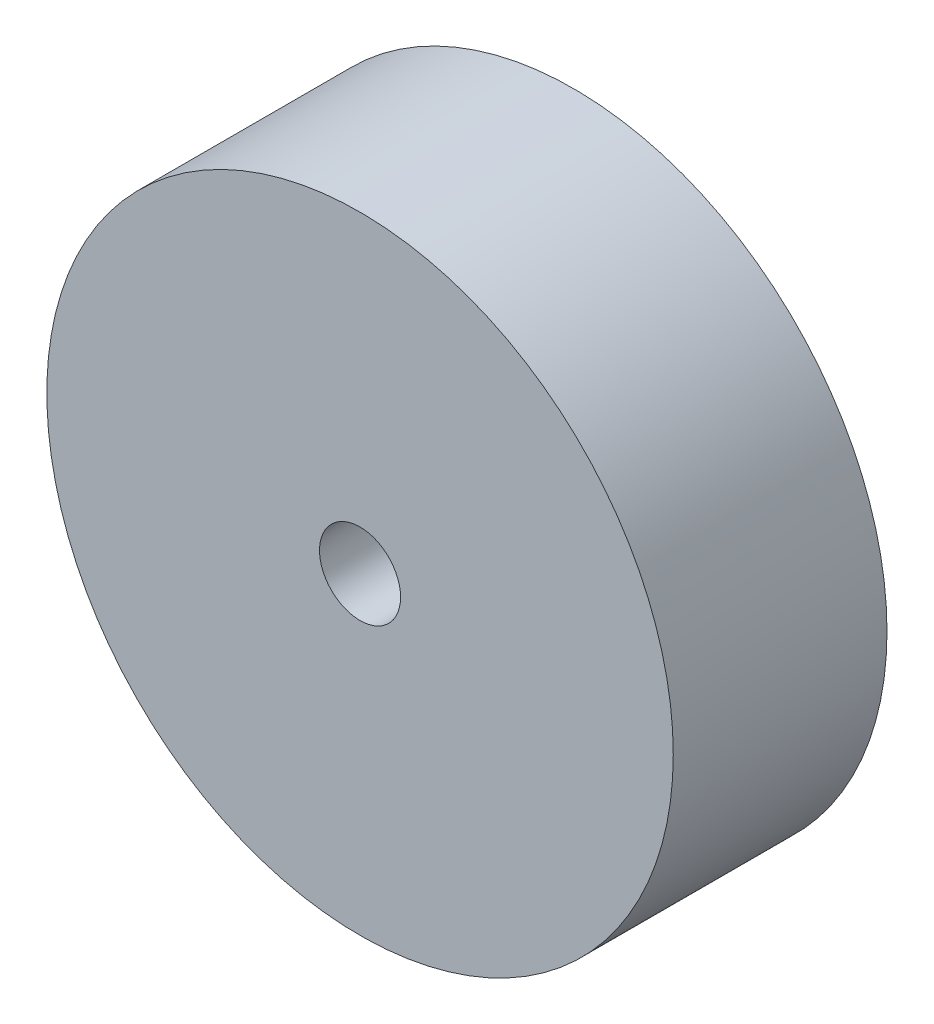
ISO-10303-21;
HEADER;
FILE_DESCRIPTION(('STEP AP214'),'2;1');
FILE_NAME('part.step','',(''),(''),'','','');
FILE_SCHEMA(('AUTOMOTIVE_DESIGN { 1 0 10303 214 1 1 1 1 }'));
ENDSEC;
DATA;
#1=APPLICATION_CONTEXT('core data for automotive mechanical design processes');
#2=APPLICATION_PROTOCOL_DEFINITION('international standard','automotive_design',2000,#1);
#3=PRODUCT_CONTEXT('',#1,'mechanical');
#4=PRODUCT('Part','Part','',(#3));
#5=PRODUCT_RELATED_PRODUCT_CATEGORY('part','',(#4));
#6=PRODUCT_DEFINITION_FORMATION('','',#4);
#7=PRODUCT_DEFINITION_CONTEXT('part definition',#1,'design');
#8=PRODUCT_DEFINITION('design','',#6,#7);
#9=PRODUCT_DEFINITION_SHAPE('','',#8);
#10=(LENGTH_UNIT() NAMED_UNIT(*) SI_UNIT(.MILLI.,.METRE.));
#11=(NAMED_UNIT(*) PLANE_ANGLE_UNIT() SI_UNIT($,.RADIAN.));
#12=(NAMED_UNIT(*) SI_UNIT($,.STERADIAN.) SOLID_ANGLE_UNIT());
#13=UNCERTAINTY_MEASURE_WITH_UNIT(LENGTH_MEASURE(1.E-05),#10,'distance_accuracy_value','');
#14=(GEOMETRIC_REPRESENTATION_CONTEXT(3) GLOBAL_UNCERTAINTY_ASSIGNED_CONTEXT((#13)) GLOBAL_UNIT_ASSIGNED_CONTEXT((#10,
#11,#12)) REPRESENTATION_CONTEXT('',''));
#15=CARTESIAN_POINT('',(0.,0.,0.));
#16=DIRECTION('',(0.,0.,1.));
#17=DIRECTION('',(1.,0.,0.));
#18=AXIS2_PLACEMENT_3D('',#15,#16,#17);
#19=CARTESIAN_POINT('',(-29.0822504710818,-1.70382614903984,5.8));
#20=DIRECTION('',(0.,0.,-1.));
#21=DIRECTION('',(-1.,0.,0.));
#22=AXIS2_PLACEMENT_3D('',#19,#20,#21);
#23=CYLINDRICAL_SURFACE('',#22,0.85);
#24=CARTESIAN_POINT('',(-29.0822504710818,-1.70382614903984,0.));
#25=DIRECTION('',(0.,0.,-1.));
#26=DIRECTION('',(-1.,0.,0.));
#27=AXIS2_PLACEMENT_3D('',#24,#25,#26);
#28=CIRCLE('',#27,0.85);
#29=CARTESIAN_POINT('',(-29.9322504710818,-1.70382614903984,0.));
#30=VERTEX_POINT('',#29);
#31=EDGE_CURVE('E70',#30,#30,#28,.T.);
#32=ORIENTED_EDGE('',*,*,#31,.T.);
#33=EDGE_LOOP('',(#32));
#34=FACE_BOUND('',#33,.T.);
#35=CARTESIAN_POINT('',(-29.0822504710818,-1.70382614903984,2.8));
#36=DIRECTION('',(0.,0.,1.));
#37=DIRECTION('',(1.,0.,0.));
#38=AXIS2_PLACEMENT_3D('',#35,#36,#37);
#39=CIRCLE('',#38,0.85);
#40=CARTESIAN_POINT('',(-28.2322504710818,-1.70382614903984,2.8));
#41=VERTEX_POINT('',#40);
#42=EDGE_CURVE('E43',#41,#41,#39,.F.);
#43=ORIENTED_EDGE('',*,*,#42,.F.);
#44=EDGE_LOOP('',(#43));
#45=FACE_BOUND('',#44,.T.);
#46=ADVANCED_FACE('F39',(#34,#45),#23,.F.);
#47=CARTESIAN_POINT('',(-29.0822504710818,-1.70382614903984,5.8));
#48=DIRECTION('',(0.,0.,-1.));
#49=DIRECTION('',(-1.,0.,0.));
#50=AXIS2_PLACEMENT_3D('',#47,#48,#49);
#51=CYLINDRICAL_SURFACE('',#50,8.5);
#52=CARTESIAN_POINT('',(-29.0822504710818,-1.70382614903984,5.8));
#53=DIRECTION('',(0.,0.,1.));
#54=DIRECTION('',(1.,0.,0.));
#55=AXIS2_PLACEMENT_3D('',#52,#53,#54);
#56=CIRCLE('',#55,8.5);
#57=CARTESIAN_POINT('',(-20.5822504710818,-1.70382614903984,5.8));
#58=VERTEX_POINT('',#57);
#59=EDGE_CURVE('E48',#58,#58,#56,.T.);
#60=ORIENTED_EDGE('',*,*,#59,.F.);
#61=EDGE_LOOP('',(#60));
#62=FACE_BOUND('',#61,.T.);
#63=CARTESIAN_POINT('',(-29.0822504710818,-1.70382614903984,0.));
#64=DIRECTION('',(0.,0.,1.));
#65=DIRECTION('',(1.,0.,0.));
#66=AXIS2_PLACEMENT_3D('',#63,#64,#65);
#67=CIRCLE('',#66,8.5);
#68=CARTESIAN_POINT('',(-20.5822504710818,-1.70382614903984,0.));
#69=VERTEX_POINT('',#68);
#70=EDGE_CURVE('E54',#69,#69,#67,.T.);
#71=ORIENTED_EDGE('',*,*,#70,.T.);
#72=EDGE_LOOP('',(#71));
#73=FACE_BOUND('',#72,.T.);
#74=ADVANCED_FACE('F87',(#62,#73),#51,.T.);
#75=CARTESIAN_POINT('',(-29.0822504710818,-1.70382614903984,5.8));
#76=DIRECTION('',(0.,0.,1.));
#77=DIRECTION('',(1.,0.,0.));
#78=AXIS2_PLACEMENT_3D('',#75,#76,#77);
#79=PLANE('',#78);
#80=CARTESIAN_POINT('',(-29.0822504710818,-1.70382614903984,5.8));
#81=DIRECTION('',(0.,0.,1.));
#82=DIRECTION('',(1.,0.,0.));
#83=AXIS2_PLACEMENT_3D('',#80,#81,#82);
#84=CIRCLE('',#83,1.1);
#85=CARTESIAN_POINT('',(-27.9822504710818,-1.70382614903984,5.8));
#86=VERTEX_POINT('',#85);
#87=EDGE_CURVE('E204',#86,#86,#84,.T.);
#88=ORIENTED_EDGE('',*,*,#87,.F.);
#89=EDGE_LOOP('',(#88));
#90=FACE_BOUND('',#89,.T.);
#91=ORIENTED_EDGE('',*,*,#59,.T.);
#92=EDGE_LOOP('',(#91));
#93=FACE_BOUND('',#92,.T.);
#94=ADVANCED_FACE('F92',(#90,#93),#79,.T.);
#95=CARTESIAN_POINT('',(-29.0822504710818,-1.70382614903984,0.));
#96=DIRECTION('',(0.,0.,1.));
#97=DIRECTION('',(1.,0.,0.));
#98=AXIS2_PLACEMENT_3D('',#95,#96,#97);
#99=PLANE('',#98);
#100=CARTESIAN_POINT('',(-29.0822504710818,-1.70382614903984,0.));
#101=DIRECTION('',(0.,0.,-1.));
#102=DIRECTION('',(-1.,0.,0.));
#103=AXIS2_PLACEMENT_3D('',#100,#101,#102);
#104=CIRCLE('',#103,8.);
#105=CARTESIAN_POINT('',(-37.0822504710818,-1.70382614903984,0.));
#106=VERTEX_POINT('',#105);
#107=EDGE_CURVE('E60',#106,#106,#104,.T.);
#108=ORIENTED_EDGE('',*,*,#107,.F.);
#109=EDGE_LOOP('',(#108));
#110=FACE_BOUND('',#109,.T.);
#111=ORIENTED_EDGE('',*,*,#70,.F.);
#112=EDGE_LOOP('',(#111));
#113=FACE_BOUND('',#112,.T.);
#114=ADVANCED_FACE('F89',(#110,#113),#99,.F.);
#115=CARTESIAN_POINT('',(-29.0822504710818,-1.70382614903984,3.2));
#116=DIRECTION('',(0.,0.,-1.));
#117=DIRECTION('',(-1.,0.,0.));
#118=AXIS2_PLACEMENT_3D('',#115,#116,#117);
#119=CYLINDRICAL_SURFACE('',#118,8.);
#120=CARTESIAN_POINT('',(-29.0822504710818,-1.70382614903984,3.2));
#121=DIRECTION('',(0.,0.,-1.));
#122=DIRECTION('',(-1.,0.,0.));
#123=AXIS2_PLACEMENT_3D('',#120,#121,#122);
#124=CIRCLE('',#123,8.);
#125=CARTESIAN_POINT('',(-37.0822504710818,-1.70382614903984,3.2));
#126=VERTEX_POINT('',#125);
#127=EDGE_CURVE('E67',#126,#126,#124,.T.);
#128=ORIENTED_EDGE('',*,*,#127,.F.);
#129=EDGE_LOOP('',(#128));
#130=FACE_BOUND('',#129,.T.);
#131=ORIENTED_EDGE('',*,*,#107,.T.);
#132=EDGE_LOOP('',(#131));
#133=FACE_BOUND('',#132,.T.);
#134=ADVANCED_FACE('F91',(#130,#133),#119,.F.);
#135=CARTESIAN_POINT('',(-29.0822504710818,-1.70382614903984,3.2));
#136=DIRECTION('',(0.,0.,-1.));
#137=DIRECTION('',(-1.,0.,0.));
#138=AXIS2_PLACEMENT_3D('',#135,#136,#137);
#139=PLANE('',#138);
#140=CARTESIAN_POINT('',(-29.0822504710818,-1.70382614903984,3.2));
#141=DIRECTION('',(0.,0.,-1.));
#142=DIRECTION('',(-1.,0.,0.));
#143=AXIS2_PLACEMENT_3D('',#140,#141,#142);
#144=CIRCLE('',#143,3.65);
#145=CARTESIAN_POINT('',(-32.7322504710818,-1.70382614903984,3.2));
#146=VERTEX_POINT('',#145);
#147=EDGE_CURVE('E10',#146,#146,#144,.F.);
#148=ORIENTED_EDGE('',*,*,#147,.T.);
#149=EDGE_LOOP('',(#148));
#150=FACE_BOUND('',#149,.T.);
#151=ORIENTED_EDGE('',*,*,#127,.T.);
#152=EDGE_LOOP('',(#151));
#153=FACE_BOUND('',#152,.T.);
#154=ADVANCED_FACE('F99',(#150,#153),#139,.T.);
#155=CARTESIAN_POINT('',(-29.0822504710818,-1.70382614903984,0.151523720864302));
#156=DIRECTION('',(0.,0.,1.));
#157=DIRECTION('',(1.,0.,0.));
#158=AXIS2_PLACEMENT_3D('',#155,#156,#157);
#159=CONICAL_SURFACE('',#158,1.,0.71558499331767);
#160=CARTESIAN_POINT('',(-29.0822504710818,-1.70382614903984,1.41692896880742));
#161=DIRECTION('',(0.,0.,1.));
#162=DIRECTION('',(1.,0.,0.));
#163=AXIS2_PLACEMENT_3D('',#160,#161,#162);
#164=CIRCLE('',#163,2.1);
#165=CARTESIAN_POINT('',(-26.9822504710818,-1.70382614903984,1.41692896880742));
#166=VERTEX_POINT('',#165);
#167=EDGE_CURVE('E57',#166,#166,#164,.T.);
#168=ORIENTED_EDGE('',*,*,#167,.T.);
#169=EDGE_LOOP('',(#168));
#170=FACE_BOUND('',#169,.T.);
#171=ORIENTED_EDGE('',*,*,#147,.F.);
#172=EDGE_LOOP('',(#171));
#173=FACE_BOUND('',#172,.T.);
#174=ADVANCED_FACE('F41',(#170,#173),#159,.T.);
#175=CARTESIAN_POINT('',(-29.0822504710818,-1.70382614903984,3.));
#176=DIRECTION('',(0.,0.,-1.));
#177=DIRECTION('',(-1.,0.,0.));
#178=AXIS2_PLACEMENT_3D('',#175,#176,#177);
#179=CYLINDRICAL_SURFACE('',#178,2.1);
#180=CARTESIAN_POINT('',(-29.0822504710818,-1.70382614903984,0.));
#181=DIRECTION('',(0.,0.,-1.));
#182=DIRECTION('',(-1.,0.,0.));
#183=AXIS2_PLACEMENT_3D('',#180,#181,#182);
#184=CIRCLE('',#183,2.1);
#185=CARTESIAN_POINT('',(-31.1822504710818,-1.70382614903984,0.));
#186=VERTEX_POINT('',#185);
#187=EDGE_CURVE('E61',#186,#186,#184,.T.);
#188=ORIENTED_EDGE('',*,*,#187,.F.);
#189=EDGE_LOOP('',(#188));
#190=FACE_BOUND('',#189,.T.);
#191=ORIENTED_EDGE('',*,*,#167,.F.);
#192=EDGE_LOOP('',(#191));
#193=FACE_BOUND('',#192,.T.);
#194=ADVANCED_FACE('F117',(#190,#193),#179,.T.);
#195=CARTESIAN_POINT('',(-29.0822504710818,-1.70382614903984,0.));
#196=DIRECTION('',(0.,0.,-1.));
#197=DIRECTION('',(-1.,0.,0.));
#198=AXIS2_PLACEMENT_3D('',#195,#196,#197);
#199=PLANE('',#198);
#200=ORIENTED_EDGE('',*,*,#31,.F.);
#201=EDGE_LOOP('',(#200));
#202=FACE_BOUND('',#201,.T.);
#203=ORIENTED_EDGE('',*,*,#187,.T.);
#204=EDGE_LOOP('',(#203));
#205=FACE_BOUND('',#204,.T.);
#206=ADVANCED_FACE('F120',(#202,#205),#199,.T.);
#207=CARTESIAN_POINT('',(-29.0822504710818,-1.70382614903984,2.8));
#208=DIRECTION('',(0.,0.,1.));
#209=DIRECTION('',(1.,0.,0.));
#210=AXIS2_PLACEMENT_3D('',#207,#208,#209);
#211=PLANE('',#210);
#212=CARTESIAN_POINT('',(-29.0822504710818,-1.70382614903984,2.8));
#213=DIRECTION('',(0.,0.,1.));
#214=DIRECTION('',(1.,0.,0.));
#215=AXIS2_PLACEMENT_3D('',#212,#213,#214);
#216=CIRCLE('',#215,1.1);
#217=CARTESIAN_POINT('',(-27.9822504710818,-1.70382614903984,2.8));
#218=VERTEX_POINT('',#217);
#219=EDGE_CURVE('E201',#218,#218,#216,.T.);
#220=ORIENTED_EDGE('',*,*,#219,.T.);
#221=EDGE_LOOP('',(#220));
#222=FACE_BOUND('',#221,.T.);
#223=ORIENTED_EDGE('',*,*,#42,.T.);
#224=EDGE_LOOP('',(#223));
#225=FACE_BOUND('',#224,.T.);
#226=ADVANCED_FACE('F124',(#222,#225),#211,.T.);
#227=CARTESIAN_POINT('',(-29.0822504710818,-1.70382614903984,2.8));
#228=DIRECTION('',(0.,0.,1.));
#229=DIRECTION('',(1.,0.,0.));
#230=AXIS2_PLACEMENT_3D('',#227,#228,#229);
#231=CYLINDRICAL_SURFACE('',#230,1.1);
#232=ORIENTED_EDGE('',*,*,#219,.F.);
#233=EDGE_LOOP('',(#232));
#234=FACE_BOUND('',#233,.T.);
#235=ORIENTED_EDGE('',*,*,#87,.T.);
#236=EDGE_LOOP('',(#235));
#237=FACE_BOUND('',#236,.T.);
#238=ADVANCED_FACE('F115',(#234,#237),#231,.F.);
#239=CLOSED_SHELL('',(#46,#74,#94,#114,#134,#154,#174,#194,#206,#226,#238));
#240=MANIFOLD_SOLID_BREP('B2',#239);
#241=ADVANCED_BREP_SHAPE_REPRESENTATION('',(#18,#240),#14);
#242=SHAPE_DEFINITION_REPRESENTATION(#9,#241);
ENDSEC;
END-ISO-10303-21;
